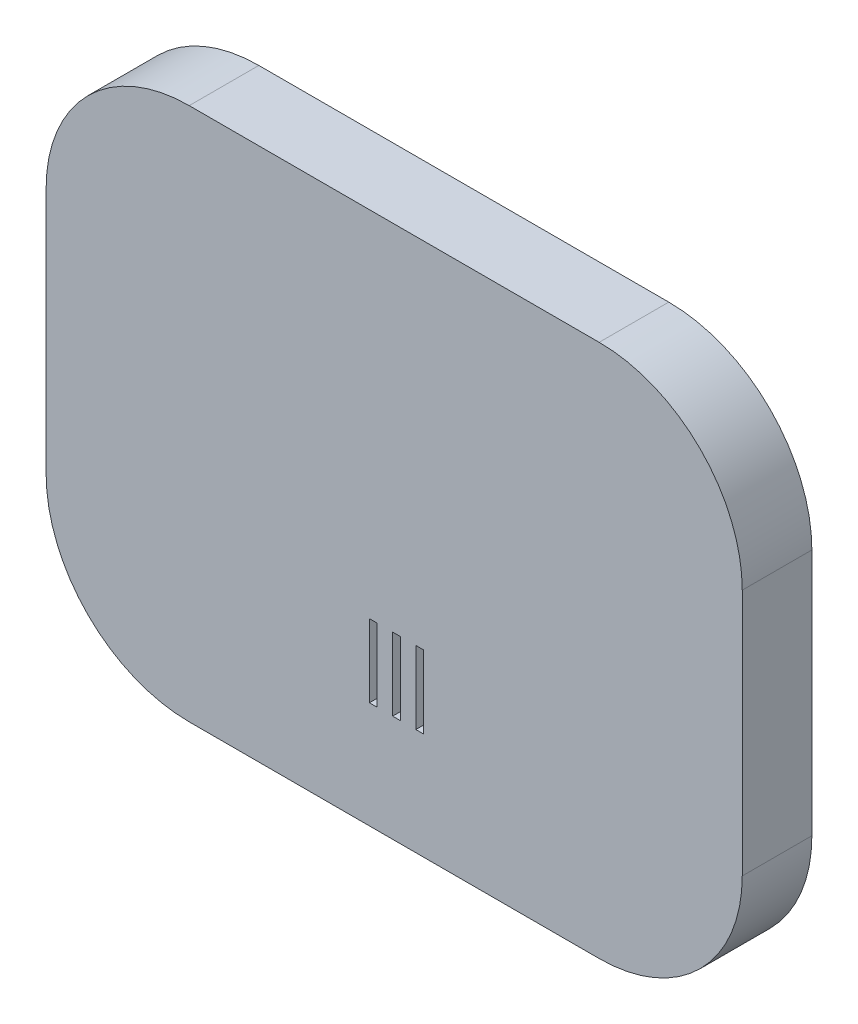
ISO-10303-21;
HEADER;
FILE_DESCRIPTION(('STEP AP214'),'2;1');
FILE_NAME('part.step','',(''),(''),'','','');
FILE_SCHEMA(('AUTOMOTIVE_DESIGN { 1 0 10303 214 1 1 1 1 }'));
ENDSEC;
DATA;
#1=APPLICATION_CONTEXT('core data for automotive mechanical design processes');
#2=APPLICATION_PROTOCOL_DEFINITION('international standard','automotive_design',2000,#1);
#3=PRODUCT_CONTEXT('',#1,'mechanical');
#4=PRODUCT('Part','Part','',(#3));
#5=PRODUCT_RELATED_PRODUCT_CATEGORY('part','',(#4));
#6=PRODUCT_DEFINITION_FORMATION('','',#4);
#7=PRODUCT_DEFINITION_CONTEXT('part definition',#1,'design');
#8=PRODUCT_DEFINITION('design','',#6,#7);
#9=PRODUCT_DEFINITION_SHAPE('','',#8);
#10=(LENGTH_UNIT() NAMED_UNIT(*) SI_UNIT(.MILLI.,.METRE.));
#11=(NAMED_UNIT(*) PLANE_ANGLE_UNIT() SI_UNIT($,.RADIAN.));
#12=(NAMED_UNIT(*) SI_UNIT($,.STERADIAN.) SOLID_ANGLE_UNIT());
#13=UNCERTAINTY_MEASURE_WITH_UNIT(LENGTH_MEASURE(1.E-05),#10,'distance_accuracy_value','');
#14=(GEOMETRIC_REPRESENTATION_CONTEXT(3) GLOBAL_UNCERTAINTY_ASSIGNED_CONTEXT((#13)) GLOBAL_UNIT_ASSIGNED_CONTEXT((#10,
#11,#12)) REPRESENTATION_CONTEXT('',''));
#15=CARTESIAN_POINT('',(0.,0.,0.));
#16=DIRECTION('',(0.,0.,1.));
#17=DIRECTION('',(1.,0.,0.));
#18=AXIS2_PLACEMENT_3D('',#15,#16,#17);
#19=CARTESIAN_POINT('',(141.037316884396,771.044811258262,7.00000000000002));
#20=DIRECTION('',(0.,0.,1.));
#21=DIRECTION('',(1.,0.,0.));
#22=AXIS2_PLACEMENT_3D('',#19,#20,#21);
#23=PLANE('',#22);
#24=DIRECTION('',(0.,-1.,0.));
#25=VECTOR('',#24,1.);
#26=CARTESIAN_POINT('',(165.334980474006,743.75440266943,7.00000000000002));
#27=LINE('',#26,#25);
#28=CARTESIAN_POINT('',(165.334980474006,743.75440266943,7.00000000000002));
#29=VERTEX_POINT('',#28);
#30=CARTESIAN_POINT('',(165.334980474006,734.335219847094,7.00000000000002));
#31=VERTEX_POINT('',#30);
#32=EDGE_CURVE('E396',#29,#31,#27,.T.);
#33=ORIENTED_EDGE('',*,*,#32,.F.);
#34=DIRECTION('',(1.,0.,0.));
#35=VECTOR('',#34,1.);
#36=CARTESIAN_POINT('',(164.334980474006,743.75440266943,7.00000000000002));
#37=LINE('',#36,#35);
#38=CARTESIAN_POINT('',(164.334980474006,743.75440266943,7.00000000000002));
#39=VERTEX_POINT('',#38);
#40=EDGE_CURVE('E393',#39,#29,#37,.T.);
#41=ORIENTED_EDGE('',*,*,#40,.F.);
#42=DIRECTION('',(0.,1.,0.));
#43=VECTOR('',#42,1.);
#44=CARTESIAN_POINT('',(164.334980474006,734.335219847093,7.00000000000002));
#45=LINE('',#44,#43);
#46=CARTESIAN_POINT('',(164.334980474006,734.335219847093,7.00000000000002));
#47=VERTEX_POINT('',#46);
#48=EDGE_CURVE('E380',#47,#39,#45,.T.);
#49=ORIENTED_EDGE('',*,*,#48,.F.);
#50=DIRECTION('',(-1.,-1.11022302462516E-13,0.));
#51=VECTOR('',#50,1.);
#52=CARTESIAN_POINT('',(165.334980474006,734.335219847094,7.00000000000002));
#53=LINE('',#52,#51);
#54=EDGE_CURVE('E400',#31,#47,#53,.T.);
#55=ORIENTED_EDGE('',*,*,#54,.F.);
#56=EDGE_LOOP('',(#33,#41,#49,#55));
#57=FACE_BOUND('',#56,.T.);
#58=DIRECTION('',(0.,-1.,0.));
#59=VECTOR('',#58,1.);
#60=CARTESIAN_POINT('',(168.334980474006,743.75440266943,7.00000000000002));
#61=LINE('',#60,#59);
#62=CARTESIAN_POINT('',(168.334980474006,743.75440266943,7.00000000000002));
#63=VERTEX_POINT('',#62);
#64=CARTESIAN_POINT('',(168.334980474006,734.335219847094,7.00000000000002));
#65=VERTEX_POINT('',#64);
#66=EDGE_CURVE('E352',#63,#65,#61,.T.);
#67=ORIENTED_EDGE('',*,*,#66,.F.);
#68=DIRECTION('',(1.,0.,0.));
#69=VECTOR('',#68,1.);
#70=CARTESIAN_POINT('',(167.334980474006,743.75440266943,7.00000000000002));
#71=LINE('',#70,#69);
#72=CARTESIAN_POINT('',(167.334980474006,743.75440266943,7.00000000000002));
#73=VERTEX_POINT('',#72);
#74=EDGE_CURVE('E349',#73,#63,#71,.T.);
#75=ORIENTED_EDGE('',*,*,#74,.F.);
#76=DIRECTION('',(0.,1.,0.));
#77=VECTOR('',#76,1.);
#78=CARTESIAN_POINT('',(167.334980474006,734.335219847093,7.00000000000002));
#79=LINE('',#78,#77);
#80=CARTESIAN_POINT('',(167.334980474006,734.335219847093,7.00000000000002));
#81=VERTEX_POINT('',#80);
#82=EDGE_CURVE('E338',#81,#73,#79,.T.);
#83=ORIENTED_EDGE('',*,*,#82,.F.);
#84=DIRECTION('',(-1.,-1.11022302462516E-13,0.));
#85=VECTOR('',#84,1.);
#86=CARTESIAN_POINT('',(168.334980474006,734.335219847094,7.00000000000002));
#87=LINE('',#86,#85);
#88=EDGE_CURVE('E357',#65,#81,#87,.T.);
#89=ORIENTED_EDGE('',*,*,#88,.F.);
#90=EDGE_LOOP('',(#67,#75,#83,#89));
#91=FACE_BOUND('',#90,.T.);
#92=DIRECTION('',(1.,0.,0.));
#93=VECTOR('',#92,1.);
#94=CARTESIAN_POINT('',(170.334980474006,743.75440266943,7.00000000000002));
#95=LINE('',#94,#93);
#96=CARTESIAN_POINT('',(170.334980474006,743.75440266943,7.00000000000002));
#97=VERTEX_POINT('',#96);
#98=CARTESIAN_POINT('',(171.334980474006,743.75440266943,7.00000000000002));
#99=VERTEX_POINT('',#98);
#100=EDGE_CURVE('E286',#97,#99,#95,.T.);
#101=ORIENTED_EDGE('',*,*,#100,.F.);
#102=DIRECTION('',(0.,1.,0.));
#103=VECTOR('',#102,1.);
#104=CARTESIAN_POINT('',(170.334980474006,734.335219847093,7.00000000000002));
#105=LINE('',#104,#103);
#106=CARTESIAN_POINT('',(170.334980474006,734.335219847093,7.00000000000002));
#107=VERTEX_POINT('',#106);
#108=EDGE_CURVE('E304',#107,#97,#105,.T.);
#109=ORIENTED_EDGE('',*,*,#108,.F.);
#110=DIRECTION('',(-1.,-1.11022302462516E-13,0.));
#111=VECTOR('',#110,1.);
#112=CARTESIAN_POINT('',(171.334980474006,734.335219847094,7.00000000000002));
#113=LINE('',#112,#111);
#114=CARTESIAN_POINT('',(171.334980474006,734.335219847094,7.00000000000002));
#115=VERTEX_POINT('',#114);
#116=EDGE_CURVE('E308',#115,#107,#113,.T.);
#117=ORIENTED_EDGE('',*,*,#116,.F.);
#118=CARTESIAN_POINT('',(167.537316884396,739.044811258261,7.00000000000002));
#119=DIRECTION('',(0.,0.,-1.));
#120=DIRECTION('',(-1.,0.,0.));
#121=AXIS2_PLACEMENT_3D('',#118,#119,#120);
#122=CIRCLE('',#121,6.05);
#123=EDGE_CURVE('E326',#115,#99,#122,.T.);
#124=ORIENTED_EDGE('',*,*,#123,.T.);
#125=EDGE_LOOP('',(#101,#109,#117,#124));
#126=FACE_BOUND('',#125,.T.);
#127=ADVANCED_FACE('F93',(#57,#91,#126),#23,.F.);
#128=DIRECTION('',(0.,-1.,0.));
#129=VECTOR('',#128,1.);
#130=CARTESIAN_POINT('',(171.334980474006,743.75440266943,7.00000000000002));
#131=LINE('',#130,#129);
#132=EDGE_CURVE('E317',#99,#115,#131,.T.);
#133=ORIENTED_EDGE('',*,*,#132,.F.);
#134=EDGE_CURVE('E423',#99,#115,#122,.T.);
#135=ORIENTED_EDGE('',*,*,#134,.T.);
#136=EDGE_LOOP('',(#133,#135));
#137=FACE_BOUND('',#136,.T.);
#138=ADVANCED_FACE('F654',(#137),#23,.F.);
#139=CARTESIAN_POINT('',(122.537316884396,771.044811258261,122.406349028615));
#140=DIRECTION('',(1.,0.,0.));
#141=DIRECTION('',(0.,1.,0.));
#142=AXIS2_PLACEMENT_3D('',#139,#140,#141);
#143=PLANE('',#142);
#144=DIRECTION('',(0.,0.,-1.));
#145=VECTOR('',#144,1.);
#146=CARTESIAN_POINT('',(122.537316884396,739.044811258262,122.406349028615));
#147=LINE('',#146,#145);
#148=CARTESIAN_POINT('',(122.537316884396,739.044811258262,9.00000000000002));
#149=VERTEX_POINT('',#148);
#150=CARTESIAN_POINT('',(122.537316884396,739.044811258262,0.));
#151=VERTEX_POINT('',#150);
#152=EDGE_CURVE('E578',#149,#151,#147,.T.);
#153=ORIENTED_EDGE('',*,*,#152,.F.);
#154=DIRECTION('',(0.,-1.,0.));
#155=VECTOR('',#154,1.);
#156=CARTESIAN_POINT('',(122.537316884396,771.044811258261,9.00000000000002));
#157=LINE('',#156,#155);
#158=CARTESIAN_POINT('',(122.537316884396,771.044811258261,9.00000000000002));
#159=VERTEX_POINT('',#158);
#160=EDGE_CURVE('E434',#159,#149,#157,.T.);
#161=ORIENTED_EDGE('',*,*,#160,.F.);
#162=DIRECTION('',(0.,0.,-1.));
#163=VECTOR('',#162,1.);
#164=CARTESIAN_POINT('',(122.537316884396,771.044811258261,122.406349028615));
#165=LINE('',#164,#163);
#166=CARTESIAN_POINT('',(122.537316884396,771.044811258261,0.));
#167=VERTEX_POINT('',#166);
#168=EDGE_CURVE('E581',#159,#167,#165,.T.);
#169=ORIENTED_EDGE('',*,*,#168,.T.);
#170=DIRECTION('',(0.,-1.,0.));
#171=VECTOR('',#170,1.);
#172=CARTESIAN_POINT('',(122.537316884396,771.044811258261,0.));
#173=LINE('',#172,#171);
#174=EDGE_CURVE('E574',#167,#151,#173,.T.);
#175=ORIENTED_EDGE('',*,*,#174,.T.);
#176=EDGE_LOOP('',(#153,#161,#169,#175));
#177=FACE_BOUND('',#176,.T.);
#178=ADVANCED_FACE('F661',(#177),#143,.F.);
#179=CARTESIAN_POINT('',(141.037316884396,771.044811258262,122.406349028615));
#180=DIRECTION('',(0.,0.,-1.));
#181=DIRECTION('',(-1.,0.,0.));
#182=AXIS2_PLACEMENT_3D('',#179,#180,#181);
#183=CYLINDRICAL_SURFACE('',#182,18.5);
#184=ORIENTED_EDGE('',*,*,#168,.F.);
#185=CARTESIAN_POINT('',(141.037316884396,771.044811258262,9.00000000000002));
#186=DIRECTION('',(0.,0.,1.));
#187=DIRECTION('',(1.,0.,0.));
#188=AXIS2_PLACEMENT_3D('',#185,#186,#187);
#189=CIRCLE('',#188,18.5);
#190=CARTESIAN_POINT('',(141.037316884396,789.544811258261,9.00000000000002));
#191=VERTEX_POINT('',#190);
#192=EDGE_CURVE('E430',#191,#159,#189,.T.);
#193=ORIENTED_EDGE('',*,*,#192,.F.);
#194=DIRECTION('',(0.,0.,-1.));
#195=VECTOR('',#194,1.);
#196=CARTESIAN_POINT('',(141.037316884396,789.544811258261,122.406349028615));
#197=LINE('',#196,#195);
#198=CARTESIAN_POINT('',(141.037316884396,789.544811258261,0.));
#199=VERTEX_POINT('',#198);
#200=EDGE_CURVE('E584',#191,#199,#197,.T.);
#201=ORIENTED_EDGE('',*,*,#200,.T.);
#202=CARTESIAN_POINT('',(141.037316884396,771.044811258262,0.));
#203=DIRECTION('',(0.,0.,1.));
#204=DIRECTION('',(1.,0.,0.));
#205=AXIS2_PLACEMENT_3D('',#202,#203,#204);
#206=CIRCLE('',#205,18.5);
#207=EDGE_CURVE('E570',#199,#167,#206,.T.);
#208=ORIENTED_EDGE('',*,*,#207,.T.);
#209=EDGE_LOOP('',(#184,#193,#201,#208));
#210=FACE_BOUND('',#209,.T.);
#211=ADVANCED_FACE('F756',(#210),#183,.T.);
#212=CARTESIAN_POINT('',(194.037316884396,789.544811258261,122.406349028615));
#213=DIRECTION('',(0.,-1.,0.));
#214=DIRECTION('',(0.,0.,-1.));
#215=AXIS2_PLACEMENT_3D('',#212,#213,#214);
#216=PLANE('',#215);
#217=ORIENTED_EDGE('',*,*,#200,.F.);
#218=DIRECTION('',(-1.,0.,0.));
#219=VECTOR('',#218,1.);
#220=CARTESIAN_POINT('',(194.037316884396,789.544811258261,9.00000000000002));
#221=LINE('',#220,#219);
#222=CARTESIAN_POINT('',(194.037316884396,789.544811258261,9.00000000000002));
#223=VERTEX_POINT('',#222);
#224=EDGE_CURVE('E458',#223,#191,#221,.T.);
#225=ORIENTED_EDGE('',*,*,#224,.F.);
#226=DIRECTION('',(0.,0.,-1.));
#227=VECTOR('',#226,1.);
#228=CARTESIAN_POINT('',(194.037316884396,789.544811258261,122.406349028615));
#229=LINE('',#228,#227);
#230=CARTESIAN_POINT('',(194.037316884396,789.544811258261,0.));
#231=VERTEX_POINT('',#230);
#232=EDGE_CURVE('E587',#223,#231,#229,.T.);
#233=ORIENTED_EDGE('',*,*,#232,.T.);
#234=DIRECTION('',(-1.,0.,0.));
#235=VECTOR('',#234,1.);
#236=CARTESIAN_POINT('',(194.037316884396,789.544811258261,0.));
#237=LINE('',#236,#235);
#238=EDGE_CURVE('E566',#231,#199,#237,.T.);
#239=ORIENTED_EDGE('',*,*,#238,.T.);
#240=EDGE_LOOP('',(#217,#225,#233,#239));
#241=FACE_BOUND('',#240,.T.);
#242=ADVANCED_FACE('F777',(#241),#216,.F.);
#243=CARTESIAN_POINT('',(194.037316884396,771.044811258262,122.406349028615));
#244=DIRECTION('',(0.,0.,-1.));
#245=DIRECTION('',(-1.,0.,0.));
#246=AXIS2_PLACEMENT_3D('',#243,#244,#245);
#247=CYLINDRICAL_SURFACE('',#246,18.5);
#248=ORIENTED_EDGE('',*,*,#232,.F.);
#249=CARTESIAN_POINT('',(194.037316884396,771.044811258262,9.00000000000002));
#250=DIRECTION('',(0.,0.,1.));
#251=DIRECTION('',(1.,0.,0.));
#252=AXIS2_PLACEMENT_3D('',#249,#250,#251);
#253=CIRCLE('',#252,18.5);
#254=CARTESIAN_POINT('',(212.537316884396,771.044811258261,9.00000000000002));
#255=VERTEX_POINT('',#254);
#256=EDGE_CURVE('E454',#255,#223,#253,.T.);
#257=ORIENTED_EDGE('',*,*,#256,.F.);
#258=DIRECTION('',(0.,0.,-1.));
#259=VECTOR('',#258,1.);
#260=CARTESIAN_POINT('',(212.537316884396,771.044811258261,122.406349028615));
#261=LINE('',#260,#259);
#262=CARTESIAN_POINT('',(212.537316884396,771.044811258261,0.));
#263=VERTEX_POINT('',#262);
#264=EDGE_CURVE('E590',#255,#263,#261,.T.);
#265=ORIENTED_EDGE('',*,*,#264,.T.);
#266=CARTESIAN_POINT('',(194.037316884396,771.044811258262,0.));
#267=DIRECTION('',(0.,0.,1.));
#268=DIRECTION('',(1.,0.,0.));
#269=AXIS2_PLACEMENT_3D('',#266,#267,#268);
#270=CIRCLE('',#269,18.5);
#271=EDGE_CURVE('E562',#263,#231,#270,.T.);
#272=ORIENTED_EDGE('',*,*,#271,.T.);
#273=EDGE_LOOP('',(#248,#257,#265,#272));
#274=FACE_BOUND('',#273,.T.);
#275=ADVANCED_FACE('F774',(#274),#247,.T.);
#276=CARTESIAN_POINT('',(212.537316884396,739.044811258261,122.406349028615));
#277=DIRECTION('',(-1.,0.,0.));
#278=DIRECTION('',(0.,0.,1.));
#279=AXIS2_PLACEMENT_3D('',#276,#277,#278);
#280=PLANE('',#279);
#281=ORIENTED_EDGE('',*,*,#264,.F.);
#282=DIRECTION('',(0.,1.,0.));
#283=VECTOR('',#282,1.);
#284=CARTESIAN_POINT('',(212.537316884396,739.044811258261,9.00000000000002));
#285=LINE('',#284,#283);
#286=CARTESIAN_POINT('',(212.537316884396,739.044811258261,9.00000000000002));
#287=VERTEX_POINT('',#286);
#288=EDGE_CURVE('E450',#287,#255,#285,.T.);
#289=ORIENTED_EDGE('',*,*,#288,.F.);
#290=DIRECTION('',(0.,0.,-1.));
#291=VECTOR('',#290,1.);
#292=CARTESIAN_POINT('',(212.537316884396,739.044811258261,122.406349028615));
#293=LINE('',#292,#291);
#294=CARTESIAN_POINT('',(212.537316884396,739.044811258261,0.));
#295=VERTEX_POINT('',#294);
#296=EDGE_CURVE('E593',#287,#295,#293,.T.);
#297=ORIENTED_EDGE('',*,*,#296,.T.);
#298=DIRECTION('',(0.,1.,0.));
#299=VECTOR('',#298,1.);
#300=CARTESIAN_POINT('',(212.537316884396,739.044811258261,0.));
#301=LINE('',#300,#299);
#302=EDGE_CURVE('E558',#295,#263,#301,.T.);
#303=ORIENTED_EDGE('',*,*,#302,.T.);
#304=EDGE_LOOP('',(#281,#289,#297,#303));
#305=FACE_BOUND('',#304,.T.);
#306=ADVANCED_FACE('F771',(#305),#280,.F.);
#307=CARTESIAN_POINT('',(194.037316884396,739.044811258261,122.406349028615));
#308=DIRECTION('',(0.,0.,-1.));
#309=DIRECTION('',(-1.,0.,0.));
#310=AXIS2_PLACEMENT_3D('',#307,#308,#309);
#311=CYLINDRICAL_SURFACE('',#310,18.5);
#312=ORIENTED_EDGE('',*,*,#296,.F.);
#313=CARTESIAN_POINT('',(194.037316884396,739.044811258261,9.00000000000002));
#314=DIRECTION('',(0.,0.,1.));
#315=DIRECTION('',(1.,0.,0.));
#316=AXIS2_PLACEMENT_3D('',#313,#314,#315);
#317=CIRCLE('',#316,18.5);
#318=CARTESIAN_POINT('',(194.037316884396,720.544811258262,9.00000000000002));
#319=VERTEX_POINT('',#318);
#320=EDGE_CURVE('E446',#319,#287,#317,.T.);
#321=ORIENTED_EDGE('',*,*,#320,.F.);
#322=DIRECTION('',(0.,0.,-1.));
#323=VECTOR('',#322,1.);
#324=CARTESIAN_POINT('',(194.037316884396,720.544811258262,122.406349028615));
#325=LINE('',#324,#323);
#326=CARTESIAN_POINT('',(194.037316884396,720.544811258262,0.));
#327=VERTEX_POINT('',#326);
#328=EDGE_CURVE('E596',#319,#327,#325,.T.);
#329=ORIENTED_EDGE('',*,*,#328,.T.);
#330=CARTESIAN_POINT('',(194.037316884396,739.044811258261,0.));
#331=DIRECTION('',(0.,0.,1.));
#332=DIRECTION('',(1.,0.,0.));
#333=AXIS2_PLACEMENT_3D('',#330,#331,#332);
#334=CIRCLE('',#333,18.5);
#335=EDGE_CURVE('E554',#327,#295,#334,.T.);
#336=ORIENTED_EDGE('',*,*,#335,.T.);
#337=EDGE_LOOP('',(#312,#321,#329,#336));
#338=FACE_BOUND('',#337,.T.);
#339=ADVANCED_FACE('F766',(#338),#311,.T.);
#340=CARTESIAN_POINT('',(141.037316884396,720.544811258262,122.406349028615));
#341=DIRECTION('',(0.,1.,0.));
#342=DIRECTION('',(0.,0.,1.));
#343=AXIS2_PLACEMENT_3D('',#340,#341,#342);
#344=PLANE('',#343);
#345=ORIENTED_EDGE('',*,*,#328,.F.);
#346=DIRECTION('',(1.,0.,0.));
#347=VECTOR('',#346,1.);
#348=CARTESIAN_POINT('',(141.037316884396,720.544811258262,9.00000000000002));
#349=LINE('',#348,#347);
#350=CARTESIAN_POINT('',(141.037316884396,720.544811258262,9.00000000000002));
#351=VERTEX_POINT('',#350);
#352=EDGE_CURVE('E442',#351,#319,#349,.T.);
#353=ORIENTED_EDGE('',*,*,#352,.F.);
#354=DIRECTION('',(0.,0.,-1.));
#355=VECTOR('',#354,1.);
#356=CARTESIAN_POINT('',(141.037316884396,720.544811258262,122.406349028615));
#357=LINE('',#356,#355);
#358=CARTESIAN_POINT('',(141.037316884396,720.544811258262,0.));
#359=VERTEX_POINT('',#358);
#360=EDGE_CURVE('E599',#351,#359,#357,.T.);
#361=ORIENTED_EDGE('',*,*,#360,.T.);
#362=DIRECTION('',(1.,0.,0.));
#363=VECTOR('',#362,1.);
#364=CARTESIAN_POINT('',(141.037316884396,720.544811258262,0.));
#365=LINE('',#364,#363);
#366=EDGE_CURVE('E550',#359,#327,#365,.T.);
#367=ORIENTED_EDGE('',*,*,#366,.T.);
#368=EDGE_LOOP('',(#345,#353,#361,#367));
#369=FACE_BOUND('',#368,.T.);
#370=ADVANCED_FACE('F648',(#369),#344,.F.);
#371=CARTESIAN_POINT('',(141.037316884396,739.044811258261,122.406349028615));
#372=DIRECTION('',(0.,0.,-1.));
#373=DIRECTION('',(-1.,0.,0.));
#374=AXIS2_PLACEMENT_3D('',#371,#372,#373);
#375=CYLINDRICAL_SURFACE('',#374,18.5);
#376=ORIENTED_EDGE('',*,*,#360,.F.);
#377=CARTESIAN_POINT('',(141.037316884396,739.044811258261,9.00000000000002));
#378=DIRECTION('',(0.,0.,1.));
#379=DIRECTION('',(1.,0.,0.));
#380=AXIS2_PLACEMENT_3D('',#377,#378,#379);
#381=CIRCLE('',#380,18.5);
#382=EDGE_CURVE('E438',#149,#351,#381,.T.);
#383=ORIENTED_EDGE('',*,*,#382,.F.);
#384=ORIENTED_EDGE('',*,*,#152,.T.);
#385=CARTESIAN_POINT('',(141.037316884396,739.044811258261,0.));
#386=DIRECTION('',(0.,0.,1.));
#387=DIRECTION('',(1.,0.,0.));
#388=AXIS2_PLACEMENT_3D('',#385,#386,#387);
#389=CIRCLE('',#388,18.5);
#390=EDGE_CURVE('E546',#151,#359,#389,.T.);
#391=ORIENTED_EDGE('',*,*,#390,.T.);
#392=EDGE_LOOP('',(#376,#383,#384,#391));
#393=FACE_BOUND('',#392,.T.);
#394=ADVANCED_FACE('F640',(#393),#375,.T.);
#395=CARTESIAN_POINT('',(141.037316884396,739.044811258261,0.));
#396=DIRECTION('',(0.,0.,1.));
#397=DIRECTION('',(1.,0.,0.));
#398=AXIS2_PLACEMENT_3D('',#395,#396,#397);
#399=PLANE('',#398);
#400=ORIENTED_EDGE('',*,*,#390,.F.);
#401=ORIENTED_EDGE('',*,*,#174,.F.);
#402=ORIENTED_EDGE('',*,*,#207,.F.);
#403=ORIENTED_EDGE('',*,*,#238,.F.);
#404=ORIENTED_EDGE('',*,*,#271,.F.);
#405=ORIENTED_EDGE('',*,*,#302,.F.);
#406=ORIENTED_EDGE('',*,*,#335,.F.);
#407=ORIENTED_EDGE('',*,*,#366,.F.);
#408=EDGE_LOOP('',(#400,#401,#402,#403,#404,#405,#406,#407));
#409=FACE_BOUND('',#408,.T.);
#410=CARTESIAN_POINT('',(141.037316884396,739.044811258261,0.));
#411=DIRECTION('',(0.,0.,1.));
#412=DIRECTION('',(1.,0.,0.));
#413=AXIS2_PLACEMENT_3D('',#410,#411,#412);
#414=CIRCLE('',#413,17.);
#415=CARTESIAN_POINT('',(124.037316884396,739.044811258262,0.));
#416=VERTEX_POINT('',#415);
#417=CARTESIAN_POINT('',(141.037316884396,722.044811258261,0.));
#418=VERTEX_POINT('',#417);
#419=EDGE_CURVE('E490',#416,#418,#414,.T.);
#420=ORIENTED_EDGE('',*,*,#419,.T.);
#421=DIRECTION('',(1.,0.,0.));
#422=VECTOR('',#421,1.);
#423=CARTESIAN_POINT('',(141.037316884396,722.044811258261,0.));
#424=LINE('',#423,#422);
#425=CARTESIAN_POINT('',(194.037316884396,722.044811258261,0.));
#426=VERTEX_POINT('',#425);
#427=EDGE_CURVE('E494',#418,#426,#424,.T.);
#428=ORIENTED_EDGE('',*,*,#427,.T.);
#429=CARTESIAN_POINT('',(194.037316884396,739.044811258261,0.));
#430=DIRECTION('',(0.,0.,1.));
#431=DIRECTION('',(1.,0.,0.));
#432=AXIS2_PLACEMENT_3D('',#429,#430,#431);
#433=CIRCLE('',#432,17.);
#434=CARTESIAN_POINT('',(211.037316884396,739.044811258261,0.));
#435=VERTEX_POINT('',#434);
#436=EDGE_CURVE('E498',#426,#435,#433,.T.);
#437=ORIENTED_EDGE('',*,*,#436,.T.);
#438=DIRECTION('',(0.,1.,0.));
#439=VECTOR('',#438,1.);
#440=CARTESIAN_POINT('',(211.037316884396,739.044811258261,0.));
#441=LINE('',#440,#439);
#442=CARTESIAN_POINT('',(211.037316884396,771.044811258261,0.));
#443=VERTEX_POINT('',#442);
#444=EDGE_CURVE('E502',#435,#443,#441,.T.);
#445=ORIENTED_EDGE('',*,*,#444,.T.);
#446=CARTESIAN_POINT('',(194.037316884396,771.044811258262,0.));
#447=DIRECTION('',(0.,0.,1.));
#448=DIRECTION('',(1.,0.,0.));
#449=AXIS2_PLACEMENT_3D('',#446,#447,#448);
#450=CIRCLE('',#449,17.);
#451=CARTESIAN_POINT('',(194.037316884396,788.044811258261,0.));
#452=VERTEX_POINT('',#451);
#453=EDGE_CURVE('E506',#443,#452,#450,.T.);
#454=ORIENTED_EDGE('',*,*,#453,.T.);
#455=DIRECTION('',(-1.,0.,0.));
#456=VECTOR('',#455,1.);
#457=CARTESIAN_POINT('',(194.037316884396,788.044811258262,0.));
#458=LINE('',#457,#456);
#459=CARTESIAN_POINT('',(141.037316884396,788.044811258262,0.));
#460=VERTEX_POINT('',#459);
#461=EDGE_CURVE('E510',#452,#460,#458,.T.);
#462=ORIENTED_EDGE('',*,*,#461,.T.);
#463=CARTESIAN_POINT('',(141.037316884396,771.044811258262,0.));
#464=DIRECTION('',(0.,0.,1.));
#465=DIRECTION('',(1.,0.,0.));
#466=AXIS2_PLACEMENT_3D('',#463,#464,#465);
#467=CIRCLE('',#466,17.);
#468=CARTESIAN_POINT('',(124.037316884396,771.044811258261,0.));
#469=VERTEX_POINT('',#468);
#470=EDGE_CURVE('E514',#460,#469,#467,.T.);
#471=ORIENTED_EDGE('',*,*,#470,.T.);
#472=DIRECTION('',(0.,-1.,0.));
#473=VECTOR('',#472,1.);
#474=CARTESIAN_POINT('',(124.037316884396,771.044811258261,0.));
#475=LINE('',#474,#473);
#476=EDGE_CURVE('E518',#469,#416,#475,.T.);
#477=ORIENTED_EDGE('',*,*,#476,.T.);
#478=EDGE_LOOP('',(#420,#428,#437,#445,#454,#462,#471,#477));
#479=FACE_BOUND('',#478,.T.);
#480=ADVANCED_FACE('F638',(#409,#479),#399,.F.);
#481=CARTESIAN_POINT('',(124.037316884396,771.044811258261,122.406349028615));
#482=DIRECTION('',(1.,0.,0.));
#483=DIRECTION('',(0.,1.,0.));
#484=AXIS2_PLACEMENT_3D('',#481,#482,#483);
#485=PLANE('',#484);
#486=DIRECTION('',(0.,0.,-1.));
#487=VECTOR('',#486,1.);
#488=CARTESIAN_POINT('',(124.037316884396,771.044811258261,122.406349028615));
#489=LINE('',#488,#487);
#490=CARTESIAN_POINT('',(124.037316884396,771.044811258261,7.00000000000002));
#491=VERTEX_POINT('',#490);
#492=EDGE_CURVE('E525',#491,#469,#489,.T.);
#493=ORIENTED_EDGE('',*,*,#492,.F.);
#494=DIRECTION('',(0.,-1.,0.));
#495=VECTOR('',#494,1.);
#496=CARTESIAN_POINT('',(124.037316884396,771.044811258261,7.00000000000002));
#497=LINE('',#496,#495);
#498=CARTESIAN_POINT('',(124.037316884396,739.044811258262,7.00000000000002));
#499=VERTEX_POINT('',#498);
#500=EDGE_CURVE('E102',#491,#499,#497,.T.);
#501=ORIENTED_EDGE('',*,*,#500,.T.);
#502=DIRECTION('',(0.,0.,-1.));
#503=VECTOR('',#502,1.);
#504=CARTESIAN_POINT('',(124.037316884396,739.044811258262,122.406349028615));
#505=LINE('',#504,#503);
#506=EDGE_CURVE('E522',#499,#416,#505,.T.);
#507=ORIENTED_EDGE('',*,*,#506,.T.);
#508=ORIENTED_EDGE('',*,*,#476,.F.);
#509=EDGE_LOOP('',(#493,#501,#507,#508));
#510=FACE_BOUND('',#509,.T.);
#511=ADVANCED_FACE('F605',(#510),#485,.T.);
#512=CARTESIAN_POINT('',(141.037316884396,771.044811258262,122.406349028615));
#513=DIRECTION('',(0.,0.,-1.));
#514=DIRECTION('',(-1.,0.,0.));
#515=AXIS2_PLACEMENT_3D('',#512,#513,#514);
#516=CYLINDRICAL_SURFACE('',#515,17.);
#517=DIRECTION('',(0.,0.,-1.));
#518=VECTOR('',#517,1.);
#519=CARTESIAN_POINT('',(141.037316884396,788.044811258262,122.406349028615));
#520=LINE('',#519,#518);
#521=CARTESIAN_POINT('',(141.037316884396,788.044811258262,7.00000000000002));
#522=VERTEX_POINT('',#521);
#523=EDGE_CURVE('E528',#522,#460,#520,.T.);
#524=ORIENTED_EDGE('',*,*,#523,.F.);
#525=CARTESIAN_POINT('',(141.037316884396,771.044811258262,7.00000000000002));
#526=DIRECTION('',(0.,0.,1.));
#527=DIRECTION('',(1.,0.,0.));
#528=AXIS2_PLACEMENT_3D('',#525,#526,#527);
#529=CIRCLE('',#528,17.);
#530=EDGE_CURVE('E462',#522,#491,#529,.T.);
#531=ORIENTED_EDGE('',*,*,#530,.T.);
#532=ORIENTED_EDGE('',*,*,#492,.T.);
#533=ORIENTED_EDGE('',*,*,#470,.F.);
#534=EDGE_LOOP('',(#524,#531,#532,#533));
#535=FACE_BOUND('',#534,.T.);
#536=ADVANCED_FACE('F613',(#535),#516,.F.);
#537=CARTESIAN_POINT('',(194.037316884396,788.044811258262,122.406349028615));
#538=DIRECTION('',(0.,-1.,0.));
#539=DIRECTION('',(0.,0.,-1.));
#540=AXIS2_PLACEMENT_3D('',#537,#538,#539);
#541=PLANE('',#540);
#542=DIRECTION('',(0.,0.,-1.));
#543=VECTOR('',#542,1.);
#544=CARTESIAN_POINT('',(194.037316884396,788.044811258261,122.406349028615));
#545=LINE('',#544,#543);
#546=CARTESIAN_POINT('',(194.037316884396,788.044811258262,7.00000000000002));
#547=VERTEX_POINT('',#546);
#548=EDGE_CURVE('E531',#547,#452,#545,.T.);
#549=ORIENTED_EDGE('',*,*,#548,.F.);
#550=DIRECTION('',(-1.,0.,0.));
#551=VECTOR('',#550,1.);
#552=CARTESIAN_POINT('',(194.037316884396,788.044811258262,7.00000000000002));
#553=LINE('',#552,#551);
#554=EDGE_CURVE('E466',#547,#522,#553,.T.);
#555=ORIENTED_EDGE('',*,*,#554,.T.);
#556=ORIENTED_EDGE('',*,*,#523,.T.);
#557=ORIENTED_EDGE('',*,*,#461,.F.);
#558=EDGE_LOOP('',(#549,#555,#556,#557));
#559=FACE_BOUND('',#558,.T.);
#560=ADVANCED_FACE('F618',(#559),#541,.T.);
#561=CARTESIAN_POINT('',(194.037316884396,771.044811258262,122.406349028615));
#562=DIRECTION('',(0.,0.,-1.));
#563=DIRECTION('',(-1.,0.,0.));
#564=AXIS2_PLACEMENT_3D('',#561,#562,#563);
#565=CYLINDRICAL_SURFACE('',#564,17.);
#566=DIRECTION('',(0.,0.,-1.));
#567=VECTOR('',#566,1.);
#568=CARTESIAN_POINT('',(211.037316884396,771.044811258261,122.406349028615));
#569=LINE('',#568,#567);
#570=CARTESIAN_POINT('',(211.037316884396,771.044811258262,7.00000000000002));
#571=VERTEX_POINT('',#570);
#572=EDGE_CURVE('E534',#571,#443,#569,.T.);
#573=ORIENTED_EDGE('',*,*,#572,.F.);
#574=CARTESIAN_POINT('',(194.037316884396,771.044811258262,7.00000000000002));
#575=DIRECTION('',(0.,0.,1.));
#576=DIRECTION('',(1.,0.,0.));
#577=AXIS2_PLACEMENT_3D('',#574,#575,#576);
#578=CIRCLE('',#577,17.);
#579=EDGE_CURVE('E470',#571,#547,#578,.T.);
#580=ORIENTED_EDGE('',*,*,#579,.T.);
#581=ORIENTED_EDGE('',*,*,#548,.T.);
#582=ORIENTED_EDGE('',*,*,#453,.F.);
#583=EDGE_LOOP('',(#573,#580,#581,#582));
#584=FACE_BOUND('',#583,.T.);
#585=ADVANCED_FACE('F623',(#584),#565,.F.);
#586=CARTESIAN_POINT('',(211.037316884396,739.044811258261,122.406349028615));
#587=DIRECTION('',(-1.,0.,0.));
#588=DIRECTION('',(0.,0.,1.));
#589=AXIS2_PLACEMENT_3D('',#586,#587,#588);
#590=PLANE('',#589);
#591=DIRECTION('',(0.,0.,-1.));
#592=VECTOR('',#591,1.);
#593=CARTESIAN_POINT('',(211.037316884396,739.044811258261,122.406349028615));
#594=LINE('',#593,#592);
#595=CARTESIAN_POINT('',(211.037316884396,739.044811258261,7.00000000000002));
#596=VERTEX_POINT('',#595);
#597=EDGE_CURVE('E537',#596,#435,#594,.T.);
#598=ORIENTED_EDGE('',*,*,#597,.F.);
#599=DIRECTION('',(0.,1.,0.));
#600=VECTOR('',#599,1.);
#601=CARTESIAN_POINT('',(211.037316884396,739.044811258261,7.00000000000002));
#602=LINE('',#601,#600);
#603=EDGE_CURVE('E474',#596,#571,#602,.T.);
#604=ORIENTED_EDGE('',*,*,#603,.T.);
#605=ORIENTED_EDGE('',*,*,#572,.T.);
#606=ORIENTED_EDGE('',*,*,#444,.F.);
#607=EDGE_LOOP('',(#598,#604,#605,#606));
#608=FACE_BOUND('',#607,.T.);
#609=ADVANCED_FACE('F626',(#608),#590,.T.);
#610=CARTESIAN_POINT('',(194.037316884396,739.044811258261,122.406349028615));
#611=DIRECTION('',(0.,0.,-1.));
#612=DIRECTION('',(-1.,0.,0.));
#613=AXIS2_PLACEMENT_3D('',#610,#611,#612);
#614=CYLINDRICAL_SURFACE('',#613,17.);
#615=DIRECTION('',(0.,0.,-1.));
#616=VECTOR('',#615,1.);
#617=CARTESIAN_POINT('',(194.037316884396,722.044811258261,122.406349028615));
#618=LINE('',#617,#616);
#619=CARTESIAN_POINT('',(194.037316884396,722.044811258262,7.00000000000002));
#620=VERTEX_POINT('',#619);
#621=EDGE_CURVE('E540',#620,#426,#618,.T.);
#622=ORIENTED_EDGE('',*,*,#621,.F.);
#623=CARTESIAN_POINT('',(194.037316884396,739.044811258261,7.00000000000002));
#624=DIRECTION('',(0.,0.,1.));
#625=DIRECTION('',(1.,0.,0.));
#626=AXIS2_PLACEMENT_3D('',#623,#624,#625);
#627=CIRCLE('',#626,17.);
#628=EDGE_CURVE('E478',#620,#596,#627,.T.);
#629=ORIENTED_EDGE('',*,*,#628,.T.);
#630=ORIENTED_EDGE('',*,*,#597,.T.);
#631=ORIENTED_EDGE('',*,*,#436,.F.);
#632=EDGE_LOOP('',(#622,#629,#630,#631));
#633=FACE_BOUND('',#632,.T.);
#634=ADVANCED_FACE('F630',(#633),#614,.F.);
#635=CARTESIAN_POINT('',(141.037316884396,722.044811258261,122.406349028615));
#636=DIRECTION('',(0.,1.,0.));
#637=DIRECTION('',(0.,0.,1.));
#638=AXIS2_PLACEMENT_3D('',#635,#636,#637);
#639=PLANE('',#638);
#640=DIRECTION('',(0.,0.,-1.));
#641=VECTOR('',#640,1.);
#642=CARTESIAN_POINT('',(141.037316884396,722.044811258261,122.406349028615));
#643=LINE('',#642,#641);
#644=CARTESIAN_POINT('',(141.037316884396,722.044811258261,7.00000000000002));
#645=VERTEX_POINT('',#644);
#646=EDGE_CURVE('E543',#645,#418,#643,.T.);
#647=ORIENTED_EDGE('',*,*,#646,.F.);
#648=DIRECTION('',(1.,0.,0.));
#649=VECTOR('',#648,1.);
#650=CARTESIAN_POINT('',(141.037316884396,722.044811258261,7.00000000000002));
#651=LINE('',#650,#649);
#652=EDGE_CURVE('E482',#645,#620,#651,.T.);
#653=ORIENTED_EDGE('',*,*,#652,.T.);
#654=ORIENTED_EDGE('',*,*,#621,.T.);
#655=ORIENTED_EDGE('',*,*,#427,.F.);
#656=EDGE_LOOP('',(#647,#653,#654,#655));
#657=FACE_BOUND('',#656,.T.);
#658=ADVANCED_FACE('F634',(#657),#639,.T.);
#659=CARTESIAN_POINT('',(141.037316884396,739.044811258261,122.406349028615));
#660=DIRECTION('',(0.,0.,-1.));
#661=DIRECTION('',(-1.,0.,0.));
#662=AXIS2_PLACEMENT_3D('',#659,#660,#661);
#663=CYLINDRICAL_SURFACE('',#662,17.);
#664=ORIENTED_EDGE('',*,*,#506,.F.);
#665=CARTESIAN_POINT('',(141.037316884396,739.044811258261,7.00000000000002));
#666=DIRECTION('',(0.,0.,1.));
#667=DIRECTION('',(1.,0.,0.));
#668=AXIS2_PLACEMENT_3D('',#665,#666,#667);
#669=CIRCLE('',#668,17.);
#670=EDGE_CURVE('E486',#499,#645,#669,.T.);
#671=ORIENTED_EDGE('',*,*,#670,.T.);
#672=ORIENTED_EDGE('',*,*,#646,.T.);
#673=ORIENTED_EDGE('',*,*,#419,.F.);
#674=EDGE_LOOP('',(#664,#671,#672,#673));
#675=FACE_BOUND('',#674,.T.);
#676=ADVANCED_FACE('F636',(#675),#663,.F.);
#677=CARTESIAN_POINT('',(167.537316884396,739.044811258261,7.00000000000002));
#678=DIRECTION('',(0.,0.,1.));
#679=DIRECTION('',(1.,0.,0.));
#680=AXIS2_PLACEMENT_3D('',#677,#678,#679);
#681=CIRCLE('',#680,12.55);
#682=CARTESIAN_POINT('',(180.087316884396,739.044811258261,7.00000000000002));
#683=VERTEX_POINT('',#682);
#684=EDGE_CURVE('E12',#683,#683,#681,.T.);
#685=ORIENTED_EDGE('',*,*,#684,.T.);
#686=EDGE_LOOP('',(#685));
#687=FACE_BOUND('',#686,.T.);
#688=ORIENTED_EDGE('',*,*,#670,.F.);
#689=ORIENTED_EDGE('',*,*,#500,.F.);
#690=ORIENTED_EDGE('',*,*,#530,.F.);
#691=ORIENTED_EDGE('',*,*,#554,.F.);
#692=ORIENTED_EDGE('',*,*,#579,.F.);
#693=ORIENTED_EDGE('',*,*,#603,.F.);
#694=ORIENTED_EDGE('',*,*,#628,.F.);
#695=ORIENTED_EDGE('',*,*,#652,.F.);
#696=EDGE_LOOP('',(#688,#689,#690,#691,#692,#693,#694,#695));
#697=FACE_BOUND('',#696,.T.);
#698=ADVANCED_FACE('F610',(#687,#697),#23,.F.);
#699=CARTESIAN_POINT('',(141.037316884396,771.044811258262,9.00000000000002));
#700=DIRECTION('',(0.,0.,1.));
#701=DIRECTION('',(1.,0.,0.));
#702=AXIS2_PLACEMENT_3D('',#699,#700,#701);
#703=PLANE('',#702);
#704=DIRECTION('',(1.,0.,0.));
#705=VECTOR('',#704,1.);
#706=CARTESIAN_POINT('',(170.334980474006,743.75440266943,9.00000000000002));
#707=LINE('',#706,#705);
#708=CARTESIAN_POINT('',(170.334980474006,743.75440266943,9.00000000000002));
#709=VERTEX_POINT('',#708);
#710=CARTESIAN_POINT('',(171.334980474006,743.75440266943,9.00000000000002));
#711=VERTEX_POINT('',#710);
#712=EDGE_CURVE('E283',#709,#711,#707,.T.);
#713=ORIENTED_EDGE('',*,*,#712,.T.);
#714=DIRECTION('',(0.,-1.,0.));
#715=VECTOR('',#714,1.);
#716=CARTESIAN_POINT('',(171.334980474006,743.75440266943,9.00000000000002));
#717=LINE('',#716,#715);
#718=CARTESIAN_POINT('',(171.334980474006,734.335219847094,9.00000000000002));
#719=VERTEX_POINT('',#718);
#720=EDGE_CURVE('E295',#711,#719,#717,.T.);
#721=ORIENTED_EDGE('',*,*,#720,.T.);
#722=DIRECTION('',(-1.,-1.11022302462516E-13,0.));
#723=VECTOR('',#722,1.);
#724=CARTESIAN_POINT('',(171.334980474006,734.335219847094,9.00000000000002));
#725=LINE('',#724,#723);
#726=CARTESIAN_POINT('',(170.334980474006,734.335219847093,9.00000000000002));
#727=VERTEX_POINT('',#726);
#728=EDGE_CURVE('E109',#719,#727,#725,.T.);
#729=ORIENTED_EDGE('',*,*,#728,.T.);
#730=DIRECTION('',(0.,1.,0.));
#731=VECTOR('',#730,1.);
#732=CARTESIAN_POINT('',(170.334980474006,734.335219847093,9.00000000000002));
#733=LINE('',#732,#731);
#734=EDGE_CURVE('E292',#727,#709,#733,.T.);
#735=ORIENTED_EDGE('',*,*,#734,.T.);
#736=EDGE_LOOP('',(#713,#721,#729,#735));
#737=FACE_BOUND('',#736,.T.);
#738=DIRECTION('',(1.,0.,0.));
#739=VECTOR('',#738,1.);
#740=CARTESIAN_POINT('',(167.334980474006,743.75440266943,9.00000000000002));
#741=LINE('',#740,#739);
#742=CARTESIAN_POINT('',(167.334980474006,743.75440266943,9.00000000000002));
#743=VERTEX_POINT('',#742);
#744=CARTESIAN_POINT('',(168.334980474006,743.75440266943,9.00000000000002));
#745=VERTEX_POINT('',#744);
#746=EDGE_CURVE('E333',#743,#745,#741,.T.);
#747=ORIENTED_EDGE('',*,*,#746,.T.);
#748=DIRECTION('',(0.,-1.,0.));
#749=VECTOR('',#748,1.);
#750=CARTESIAN_POINT('',(168.334980474006,743.75440266943,9.00000000000002));
#751=LINE('',#750,#749);
#752=CARTESIAN_POINT('',(168.334980474006,734.335219847094,9.00000000000002));
#753=VERTEX_POINT('',#752);
#754=EDGE_CURVE('E337',#745,#753,#751,.T.);
#755=ORIENTED_EDGE('',*,*,#754,.T.);
#756=DIRECTION('',(-1.,-1.11022302462516E-13,0.));
#757=VECTOR('',#756,1.);
#758=CARTESIAN_POINT('',(168.334980474006,734.335219847094,9.00000000000002));
#759=LINE('',#758,#757);
#760=CARTESIAN_POINT('',(167.334980474006,734.335219847093,9.00000000000002));
#761=VERTEX_POINT('',#760);
#762=EDGE_CURVE('E117',#753,#761,#759,.T.);
#763=ORIENTED_EDGE('',*,*,#762,.T.);
#764=DIRECTION('',(0.,1.,0.));
#765=VECTOR('',#764,1.);
#766=CARTESIAN_POINT('',(167.334980474006,734.335219847093,9.00000000000002));
#767=LINE('',#766,#765);
#768=EDGE_CURVE('E344',#761,#743,#767,.T.);
#769=ORIENTED_EDGE('',*,*,#768,.T.);
#770=EDGE_LOOP('',(#747,#755,#763,#769));
#771=FACE_BOUND('',#770,.T.);
#772=DIRECTION('',(1.,0.,0.));
#773=VECTOR('',#772,1.);
#774=CARTESIAN_POINT('',(164.334980474006,743.75440266943,9.00000000000002));
#775=LINE('',#774,#773);
#776=CARTESIAN_POINT('',(164.334980474006,743.75440266943,9.00000000000002));
#777=VERTEX_POINT('',#776);
#778=CARTESIAN_POINT('',(165.334980474006,743.75440266943,9.00000000000002));
#779=VERTEX_POINT('',#778);
#780=EDGE_CURVE('E375',#777,#779,#775,.T.);
#781=ORIENTED_EDGE('',*,*,#780,.T.);
#782=DIRECTION('',(0.,-1.,0.));
#783=VECTOR('',#782,1.);
#784=CARTESIAN_POINT('',(165.334980474006,743.75440266943,9.00000000000002));
#785=LINE('',#784,#783);
#786=CARTESIAN_POINT('',(165.334980474006,734.335219847094,9.00000000000002));
#787=VERTEX_POINT('',#786);
#788=EDGE_CURVE('E379',#779,#787,#785,.T.);
#789=ORIENTED_EDGE('',*,*,#788,.T.);
#790=DIRECTION('',(-1.,-1.11022302462516E-13,0.));
#791=VECTOR('',#790,1.);
#792=CARTESIAN_POINT('',(165.334980474006,734.335219847094,9.00000000000002));
#793=LINE('',#792,#791);
#794=CARTESIAN_POINT('',(164.334980474006,734.335219847093,9.00000000000002));
#795=VERTEX_POINT('',#794);
#796=EDGE_CURVE('E384',#787,#795,#793,.T.);
#797=ORIENTED_EDGE('',*,*,#796,.T.);
#798=DIRECTION('',(0.,1.,0.));
#799=VECTOR('',#798,1.);
#800=CARTESIAN_POINT('',(164.334980474006,734.335219847093,9.00000000000002));
#801=LINE('',#800,#799);
#802=EDGE_CURVE('E388',#795,#777,#801,.T.);
#803=ORIENTED_EDGE('',*,*,#802,.T.);
#804=EDGE_LOOP('',(#781,#789,#797,#803));
#805=FACE_BOUND('',#804,.T.);
#806=ORIENTED_EDGE('',*,*,#192,.T.);
#807=ORIENTED_EDGE('',*,*,#160,.T.);
#808=ORIENTED_EDGE('',*,*,#382,.T.);
#809=ORIENTED_EDGE('',*,*,#352,.T.);
#810=ORIENTED_EDGE('',*,*,#320,.T.);
#811=ORIENTED_EDGE('',*,*,#288,.T.);
#812=ORIENTED_EDGE('',*,*,#256,.T.);
#813=ORIENTED_EDGE('',*,*,#224,.T.);
#814=EDGE_LOOP('',(#806,#807,#808,#809,#810,#811,#812,#813));
#815=FACE_BOUND('',#814,.T.);
#816=ADVANCED_FACE('F300',(#737,#771,#805,#815),#703,.T.);
#817=CARTESIAN_POINT('',(167.537316884396,739.044811258261,2.00000000000003));
#818=DIRECTION('',(0.,0.,-1.));
#819=DIRECTION('',(-1.,0.,0.));
#820=AXIS2_PLACEMENT_3D('',#817,#818,#819);
#821=PLANE('',#820);
#822=CARTESIAN_POINT('',(167.537316884396,739.044811258261,2.00000000000003));
#823=DIRECTION('',(0.,0.,-1.));
#824=DIRECTION('',(-1.,0.,0.));
#825=AXIS2_PLACEMENT_3D('',#822,#823,#824);
#826=CIRCLE('',#825,7.55);
#827=CARTESIAN_POINT('',(159.987316884396,739.044811258261,2.00000000000003));
#828=VERTEX_POINT('',#827);
#829=EDGE_CURVE('E422',#828,#828,#826,.T.);
#830=ORIENTED_EDGE('',*,*,#829,.T.);
#831=EDGE_LOOP('',(#830));
#832=FACE_BOUND('',#831,.T.);
#833=CARTESIAN_POINT('',(167.537316884396,739.044811258261,2.00000000000003));
#834=DIRECTION('',(0.,0.,-1.));
#835=DIRECTION('',(-1.,0.,0.));
#836=AXIS2_PLACEMENT_3D('',#833,#834,#835);
#837=CIRCLE('',#836,6.05);
#838=CARTESIAN_POINT('',(161.487316884396,739.044811258261,2.00000000000003));
#839=VERTEX_POINT('',#838);
#840=EDGE_CURVE('E418',#839,#839,#837,.T.);
#841=ORIENTED_EDGE('',*,*,#840,.F.);
#842=EDGE_LOOP('',(#841));
#843=FACE_BOUND('',#842,.T.);
#844=ADVANCED_FACE('F672',(#832,#843),#821,.T.);
#845=CARTESIAN_POINT('',(167.537316884396,739.044811258261,2.00000000000003));
#846=DIRECTION('',(0.,0.,1.));
#847=DIRECTION('',(1.,0.,0.));
#848=AXIS2_PLACEMENT_3D('',#845,#846,#847);
#849=CYLINDRICAL_SURFACE('',#848,6.05);
#850=ORIENTED_EDGE('',*,*,#840,.T.);
#851=EDGE_LOOP('',(#850));
#852=FACE_BOUND('',#851,.T.);
#853=ORIENTED_EDGE('',*,*,#134,.F.);
#854=ORIENTED_EDGE('',*,*,#123,.F.);
#855=EDGE_LOOP('',(#853,#854));
#856=FACE_BOUND('',#855,.T.);
#857=ADVANCED_FACE('F679',(#852,#856),#849,.F.);
#858=CARTESIAN_POINT('',(167.537316884396,739.044811258261,2.00000000000003));
#859=DIRECTION('',(0.,0.,1.));
#860=DIRECTION('',(1.,0.,0.));
#861=AXIS2_PLACEMENT_3D('',#858,#859,#860);
#862=TOROIDAL_SURFACE('',#861,12.55,5.);
#863=ORIENTED_EDGE('',*,*,#684,.F.);
#864=EDGE_LOOP('',(#863));
#865=FACE_BOUND('',#864,.T.);
#866=ORIENTED_EDGE('',*,*,#829,.F.);
#867=EDGE_LOOP('',(#866));
#868=FACE_BOUND('',#867,.T.);
#869=ADVANCED_FACE('F95',(#865,#868),#862,.F.);
#870=CARTESIAN_POINT('',(164.334980474006,743.75440266943,9.00000000000002));
#871=DIRECTION('',(0.,1.,0.));
#872=DIRECTION('',(0.,0.,1.));
#873=AXIS2_PLACEMENT_3D('',#870,#871,#872);
#874=PLANE('',#873);
#875=ORIENTED_EDGE('',*,*,#40,.T.);
#876=DIRECTION('',(0.,0.,-1.));
#877=VECTOR('',#876,1.);
#878=CARTESIAN_POINT('',(165.334980474006,743.75440266943,9.00000000000002));
#879=LINE('',#878,#877);
#880=EDGE_CURVE('E392',#779,#29,#879,.T.);
#881=ORIENTED_EDGE('',*,*,#880,.F.);
#882=ORIENTED_EDGE('',*,*,#780,.F.);
#883=DIRECTION('',(0.,0.,-1.));
#884=VECTOR('',#883,1.);
#885=CARTESIAN_POINT('',(164.334980474006,743.75440266943,9.00000000000002));
#886=LINE('',#885,#884);
#887=EDGE_CURVE('E353',#777,#39,#886,.T.);
#888=ORIENTED_EDGE('',*,*,#887,.T.);
#889=EDGE_LOOP('',(#875,#881,#882,#888));
#890=FACE_BOUND('',#889,.T.);
#891=ADVANCED_FACE('F678',(#890),#874,.F.);
#892=CARTESIAN_POINT('',(164.334980474006,734.335219847093,9.00000000000002));
#893=DIRECTION('',(-1.,0.,0.));
#894=DIRECTION('',(0.,0.,1.));
#895=AXIS2_PLACEMENT_3D('',#892,#893,#894);
#896=PLANE('',#895);
#897=ORIENTED_EDGE('',*,*,#48,.T.);
#898=ORIENTED_EDGE('',*,*,#887,.F.);
#899=ORIENTED_EDGE('',*,*,#802,.F.);
#900=DIRECTION('',(0.,0.,-1.));
#901=VECTOR('',#900,1.);
#902=CARTESIAN_POINT('',(164.334980474006,734.335219847093,9.00000000000002));
#903=LINE('',#902,#901);
#904=EDGE_CURVE('E409',#795,#47,#903,.T.);
#905=ORIENTED_EDGE('',*,*,#904,.T.);
#906=EDGE_LOOP('',(#897,#898,#899,#905));
#907=FACE_BOUND('',#906,.T.);
#908=ADVANCED_FACE('F727',(#907),#896,.F.);
#909=CARTESIAN_POINT('',(165.334980474006,734.335219847094,9.00000000000002));
#910=DIRECTION('',(1.11022302462516E-13,-1.,0.));
#911=DIRECTION('',(1.,1.11022302462516E-13,0.));
#912=AXIS2_PLACEMENT_3D('',#909,#910,#911);
#913=PLANE('',#912);
#914=ORIENTED_EDGE('',*,*,#54,.T.);
#915=ORIENTED_EDGE('',*,*,#904,.F.);
#916=ORIENTED_EDGE('',*,*,#796,.F.);
#917=DIRECTION('',(0.,0.,-1.));
#918=VECTOR('',#917,1.);
#919=CARTESIAN_POINT('',(165.334980474006,734.335219847094,9.00000000000002));
#920=LINE('',#919,#918);
#921=EDGE_CURVE('E412',#787,#31,#920,.T.);
#922=ORIENTED_EDGE('',*,*,#921,.T.);
#923=EDGE_LOOP('',(#914,#915,#916,#922));
#924=FACE_BOUND('',#923,.T.);
#925=ADVANCED_FACE('F730',(#924),#913,.F.);
#926=CARTESIAN_POINT('',(165.334980474006,743.75440266943,9.00000000000002));
#927=DIRECTION('',(1.,0.,0.));
#928=DIRECTION('',(0.,0.,-1.));
#929=AXIS2_PLACEMENT_3D('',#926,#927,#928);
#930=PLANE('',#929);
#931=ORIENTED_EDGE('',*,*,#32,.T.);
#932=ORIENTED_EDGE('',*,*,#921,.F.);
#933=ORIENTED_EDGE('',*,*,#788,.F.);
#934=ORIENTED_EDGE('',*,*,#880,.T.);
#935=EDGE_LOOP('',(#931,#932,#933,#934));
#936=FACE_BOUND('',#935,.T.);
#937=ADVANCED_FACE('F725',(#936),#930,.F.);
#938=CARTESIAN_POINT('',(167.334980474006,743.75440266943,9.00000000000002));
#939=DIRECTION('',(0.,1.,0.));
#940=DIRECTION('',(0.,0.,1.));
#941=AXIS2_PLACEMENT_3D('',#938,#939,#940);
#942=PLANE('',#941);
#943=ORIENTED_EDGE('',*,*,#74,.T.);
#944=DIRECTION('',(0.,0.,-1.));
#945=VECTOR('',#944,1.);
#946=CARTESIAN_POINT('',(168.334980474006,743.75440266943,9.00000000000002));
#947=LINE('',#946,#945);
#948=EDGE_CURVE('E348',#745,#63,#947,.T.);
#949=ORIENTED_EDGE('',*,*,#948,.F.);
#950=ORIENTED_EDGE('',*,*,#746,.F.);
#951=DIRECTION('',(0.,0.,-1.));
#952=VECTOR('',#951,1.);
#953=CARTESIAN_POINT('',(167.334980474006,743.75440266943,9.00000000000002));
#954=LINE('',#953,#952);
#955=EDGE_CURVE('E318',#743,#73,#954,.T.);
#956=ORIENTED_EDGE('',*,*,#955,.T.);
#957=EDGE_LOOP('',(#943,#949,#950,#956));
#958=FACE_BOUND('',#957,.T.);
#959=ADVANCED_FACE('F716',(#958),#942,.F.);
#960=CARTESIAN_POINT('',(167.334980474006,734.335219847093,9.00000000000002));
#961=DIRECTION('',(-1.,0.,0.));
#962=DIRECTION('',(0.,0.,1.));
#963=AXIS2_PLACEMENT_3D('',#960,#961,#962);
#964=PLANE('',#963);
#965=ORIENTED_EDGE('',*,*,#82,.T.);
#966=ORIENTED_EDGE('',*,*,#955,.F.);
#967=ORIENTED_EDGE('',*,*,#768,.F.);
#968=DIRECTION('',(0.,0.,-1.));
#969=VECTOR('',#968,1.);
#970=CARTESIAN_POINT('',(167.334980474006,734.335219847093,9.00000000000002));
#971=LINE('',#970,#969);
#972=EDGE_CURVE('E366',#761,#81,#971,.T.);
#973=ORIENTED_EDGE('',*,*,#972,.T.);
#974=EDGE_LOOP('',(#965,#966,#967,#973));
#975=FACE_BOUND('',#974,.T.);
#976=ADVANCED_FACE('F712',(#975),#964,.F.);
#977=CARTESIAN_POINT('',(168.334980474006,734.335219847094,9.00000000000002));
#978=DIRECTION('',(1.11022302462516E-13,-1.,0.));
#979=DIRECTION('',(1.,1.11022302462516E-13,0.));
#980=AXIS2_PLACEMENT_3D('',#977,#978,#979);
#981=PLANE('',#980);
#982=ORIENTED_EDGE('',*,*,#88,.T.);
#983=ORIENTED_EDGE('',*,*,#972,.F.);
#984=ORIENTED_EDGE('',*,*,#762,.F.);
#985=DIRECTION('',(0.,0.,-1.));
#986=VECTOR('',#985,1.);
#987=CARTESIAN_POINT('',(168.334980474006,734.335219847094,9.00000000000002));
#988=LINE('',#987,#986);
#989=EDGE_CURVE('E369',#753,#65,#988,.T.);
#990=ORIENTED_EDGE('',*,*,#989,.T.);
#991=EDGE_LOOP('',(#982,#983,#984,#990));
#992=FACE_BOUND('',#991,.T.);
#993=ADVANCED_FACE('F715',(#992),#981,.F.);
#994=CARTESIAN_POINT('',(168.334980474006,743.75440266943,9.00000000000002));
#995=DIRECTION('',(1.,0.,0.));
#996=DIRECTION('',(0.,0.,-1.));
#997=AXIS2_PLACEMENT_3D('',#994,#995,#996);
#998=PLANE('',#997);
#999=ORIENTED_EDGE('',*,*,#66,.T.);
#1000=ORIENTED_EDGE('',*,*,#989,.F.);
#1001=ORIENTED_EDGE('',*,*,#754,.F.);
#1002=ORIENTED_EDGE('',*,*,#948,.T.);
#1003=EDGE_LOOP('',(#999,#1000,#1001,#1002));
#1004=FACE_BOUND('',#1003,.T.);
#1005=ADVANCED_FACE('F707',(#1004),#998,.F.);
#1006=CARTESIAN_POINT('',(170.334980474006,743.75440266943,9.00000000000002));
#1007=DIRECTION('',(0.,1.,0.));
#1008=DIRECTION('',(0.,0.,1.));
#1009=AXIS2_PLACEMENT_3D('',#1006,#1007,#1008);
#1010=PLANE('',#1009);
#1011=ORIENTED_EDGE('',*,*,#100,.T.);
#1012=DIRECTION('',(0.,0.,-1.));
#1013=VECTOR('',#1012,1.);
#1014=CARTESIAN_POINT('',(171.334980474006,743.75440266943,9.00000000000002));
#1015=LINE('',#1014,#1013);
#1016=EDGE_CURVE('E279',#711,#99,#1015,.T.);
#1017=ORIENTED_EDGE('',*,*,#1016,.F.);
#1018=ORIENTED_EDGE('',*,*,#712,.F.);
#1019=DIRECTION('',(0.,0.,-1.));
#1020=VECTOR('',#1019,1.);
#1021=CARTESIAN_POINT('',(170.334980474006,743.75440266943,9.00000000000002));
#1022=LINE('',#1021,#1020);
#1023=EDGE_CURVE('E323',#709,#97,#1022,.T.);
#1024=ORIENTED_EDGE('',*,*,#1023,.T.);
#1025=EDGE_LOOP('',(#1011,#1017,#1018,#1024));
#1026=FACE_BOUND('',#1025,.T.);
#1027=ADVANCED_FACE('F281',(#1026),#1010,.F.);
#1028=CARTESIAN_POINT('',(170.334980474006,734.335219847093,9.00000000000002));
#1029=DIRECTION('',(-1.,0.,0.));
#1030=DIRECTION('',(0.,0.,1.));
#1031=AXIS2_PLACEMENT_3D('',#1028,#1029,#1030);
#1032=PLANE('',#1031);
#1033=ORIENTED_EDGE('',*,*,#108,.T.);
#1034=ORIENTED_EDGE('',*,*,#1023,.F.);
#1035=ORIENTED_EDGE('',*,*,#734,.F.);
#1036=DIRECTION('',(0.,0.,-1.));
#1037=VECTOR('',#1036,1.);
#1038=CARTESIAN_POINT('',(170.334980474006,734.335219847093,9.00000000000002));
#1039=LINE('',#1038,#1037);
#1040=EDGE_CURVE('E327',#727,#107,#1039,.T.);
#1041=ORIENTED_EDGE('',*,*,#1040,.T.);
#1042=EDGE_LOOP('',(#1033,#1034,#1035,#1041));
#1043=FACE_BOUND('',#1042,.T.);
#1044=ADVANCED_FACE('F699',(#1043),#1032,.F.);
#1045=CARTESIAN_POINT('',(171.334980474006,734.335219847094,9.00000000000002));
#1046=DIRECTION('',(1.11022302462516E-13,-1.,0.));
#1047=DIRECTION('',(1.,1.11022302462516E-13,0.));
#1048=AXIS2_PLACEMENT_3D('',#1045,#1046,#1047);
#1049=PLANE('',#1048);
#1050=ORIENTED_EDGE('',*,*,#116,.T.);
#1051=ORIENTED_EDGE('',*,*,#1040,.F.);
#1052=ORIENTED_EDGE('',*,*,#728,.F.);
#1053=DIRECTION('',(0.,0.,-1.));
#1054=VECTOR('',#1053,1.);
#1055=CARTESIAN_POINT('',(171.334980474006,734.335219847094,9.00000000000002));
#1056=LINE('',#1055,#1054);
#1057=EDGE_CURVE('E291',#719,#115,#1056,.T.);
#1058=ORIENTED_EDGE('',*,*,#1057,.T.);
#1059=EDGE_LOOP('',(#1050,#1051,#1052,#1058));
#1060=FACE_BOUND('',#1059,.T.);
#1061=ADVANCED_FACE('F697',(#1060),#1049,.F.);
#1062=CARTESIAN_POINT('',(171.334980474006,743.75440266943,9.00000000000002));
#1063=DIRECTION('',(1.,0.,0.));
#1064=DIRECTION('',(0.,0.,-1.));
#1065=AXIS2_PLACEMENT_3D('',#1062,#1063,#1064);
#1066=PLANE('',#1065);
#1067=ORIENTED_EDGE('',*,*,#132,.T.);
#1068=ORIENTED_EDGE('',*,*,#1057,.F.);
#1069=ORIENTED_EDGE('',*,*,#720,.F.);
#1070=ORIENTED_EDGE('',*,*,#1016,.T.);
#1071=EDGE_LOOP('',(#1067,#1068,#1069,#1070));
#1072=FACE_BOUND('',#1071,.T.);
#1073=ADVANCED_FACE('F296',(#1072),#1066,.F.);
#1074=CLOSED_SHELL('',(#127,#138,#178,#211,#242,#275,#306,#339,#370,#394,#480,#511,#536,#560,
#585,#609,#634,#658,#676,#698,#816,#844,#857,#869,#891,#908,#925,#937,#959,#976,#993,#1005,
#1027,#1044,#1061,#1073));
#1075=MANIFOLD_SOLID_BREP('B2',#1074);
#1076=ADVANCED_BREP_SHAPE_REPRESENTATION('',(#18,#1075),#14);
#1077=SHAPE_DEFINITION_REPRESENTATION(#9,#1076);
ENDSEC;
END-ISO-10303-21;
